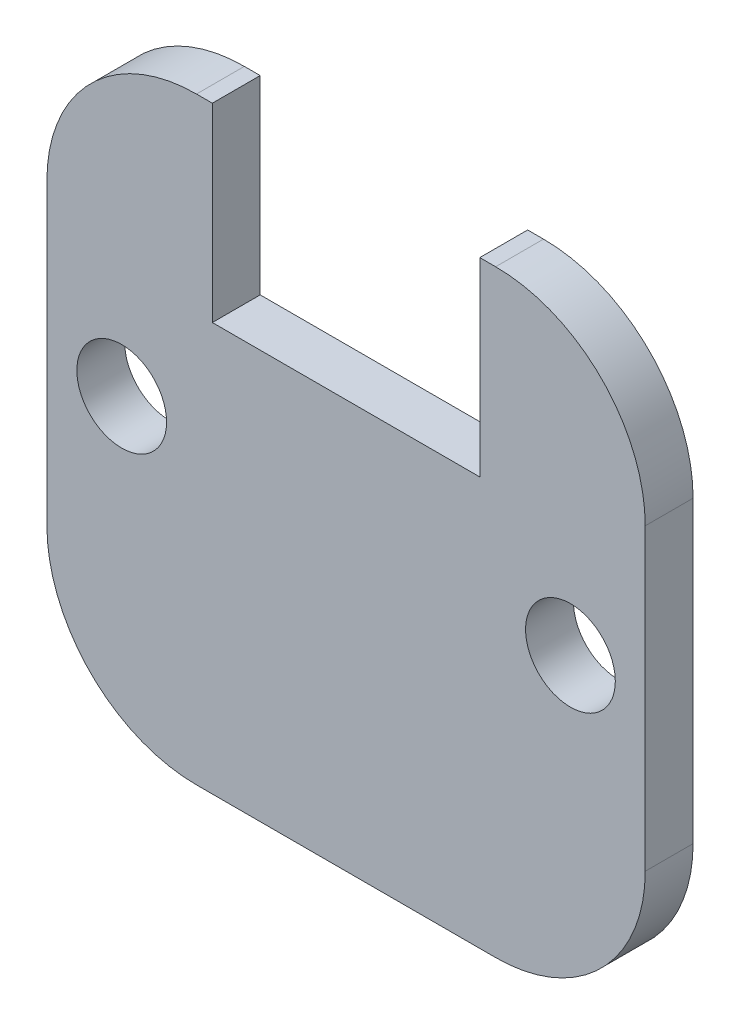
ISO-10303-21;
HEADER;
FILE_DESCRIPTION(('STEP AP214'),'2;1');
FILE_NAME('part.step','',(''),(''),'','','');
FILE_SCHEMA(('AUTOMOTIVE_DESIGN { 1 0 10303 214 1 1 1 1 }'));
ENDSEC;
DATA;
#1=APPLICATION_CONTEXT('core data for automotive mechanical design processes');
#2=APPLICATION_PROTOCOL_DEFINITION('international standard','automotive_design',2000,#1);
#3=PRODUCT_CONTEXT('',#1,'mechanical');
#4=PRODUCT('Part','Part','',(#3));
#5=PRODUCT_RELATED_PRODUCT_CATEGORY('part','',(#4));
#6=PRODUCT_DEFINITION_FORMATION('','',#4);
#7=PRODUCT_DEFINITION_CONTEXT('part definition',#1,'design');
#8=PRODUCT_DEFINITION('design','',#6,#7);
#9=PRODUCT_DEFINITION_SHAPE('','',#8);
#10=(LENGTH_UNIT() NAMED_UNIT(*) SI_UNIT(.MILLI.,.METRE.));
#11=(NAMED_UNIT(*) PLANE_ANGLE_UNIT() SI_UNIT($,.RADIAN.));
#12=(NAMED_UNIT(*) SI_UNIT($,.STERADIAN.) SOLID_ANGLE_UNIT());
#13=UNCERTAINTY_MEASURE_WITH_UNIT(LENGTH_MEASURE(1.E-05),#10,'distance_accuracy_value','');
#14=(GEOMETRIC_REPRESENTATION_CONTEXT(3) GLOBAL_UNCERTAINTY_ASSIGNED_CONTEXT((#13)) GLOBAL_UNIT_ASSIGNED_CONTEXT((#10,
#11,#12)) REPRESENTATION_CONTEXT('',''));
#15=CARTESIAN_POINT('',(0.,0.,0.));
#16=DIRECTION('',(0.,0.,1.));
#17=DIRECTION('',(1.,0.,0.));
#18=AXIS2_PLACEMENT_3D('',#15,#16,#17);
#19=CARTESIAN_POINT('',(115.985407190051,0.,1.6));
#20=DIRECTION('',(1.,0.,0.));
#21=DIRECTION('',(0.,0.,-1.));
#22=AXIS2_PLACEMENT_3D('',#19,#20,#21);
#23=PLANE('',#22);
#24=DIRECTION('',(0.,-1.,0.));
#25=VECTOR('',#24,1.);
#26=CARTESIAN_POINT('',(115.985407190051,0.,0.));
#27=LINE('',#26,#25);
#28=CARTESIAN_POINT('',(115.985407190051,133.738694525702,0.));
#29=VERTEX_POINT('',#28);
#30=CARTESIAN_POINT('',(115.985407190051,127.388694525702,0.));
#31=VERTEX_POINT('',#30);
#32=EDGE_CURVE('E234',#29,#31,#27,.T.);
#33=ORIENTED_EDGE('',*,*,#32,.F.);
#34=DIRECTION('',(0.,0.,-1.));
#35=VECTOR('',#34,1.);
#36=CARTESIAN_POINT('',(115.985407190051,133.738694525702,1.6));
#37=LINE('',#36,#35);
#38=CARTESIAN_POINT('',(115.985407190051,133.738694525702,1.6));
#39=VERTEX_POINT('',#38);
#40=EDGE_CURVE('E11',#39,#29,#37,.T.);
#41=ORIENTED_EDGE('',*,*,#40,.F.);
#42=DIRECTION('',(0.,-1.,0.));
#43=VECTOR('',#42,1.);
#44=CARTESIAN_POINT('',(115.985407190051,0.,1.6));
#45=LINE('',#44,#43);
#46=CARTESIAN_POINT('',(115.985407190051,127.388694525702,1.6));
#47=VERTEX_POINT('',#46);
#48=EDGE_CURVE('E167',#39,#47,#45,.T.);
#49=ORIENTED_EDGE('',*,*,#48,.T.);
#50=DIRECTION('',(0.,0.,-1.));
#51=VECTOR('',#50,1.);
#52=CARTESIAN_POINT('',(115.985407190051,127.388694525702,1.6));
#53=LINE('',#52,#51);
#54=EDGE_CURVE('E56',#47,#31,#53,.T.);
#55=ORIENTED_EDGE('',*,*,#54,.T.);
#56=EDGE_LOOP('',(#33,#41,#49,#55));
#57=FACE_BOUND('',#56,.T.);
#58=ADVANCED_FACE('F39',(#57),#23,.T.);
#59=CARTESIAN_POINT('',(0.,133.738694525702,1.6));
#60=DIRECTION('',(0.,1.,0.));
#61=DIRECTION('',(0.,0.,1.));
#62=AXIS2_PLACEMENT_3D('',#59,#60,#61);
#63=PLANE('',#62);
#64=DIRECTION('',(1.,0.,0.));
#65=VECTOR('',#64,1.);
#66=CARTESIAN_POINT('',(0.,133.738694525702,0.));
#67=LINE('',#66,#65);
#68=CARTESIAN_POINT('',(115.455407190051,133.738694525702,0.));
#69=VERTEX_POINT('',#68);
#70=EDGE_CURVE('E227',#69,#29,#67,.T.);
#71=ORIENTED_EDGE('',*,*,#70,.F.);
#72=DIRECTION('',(0.,0.,-1.));
#73=VECTOR('',#72,1.);
#74=CARTESIAN_POINT('',(115.455407190051,133.738694525702,1.6));
#75=LINE('',#74,#73);
#76=CARTESIAN_POINT('',(115.455407190051,133.738694525702,1.6));
#77=VERTEX_POINT('',#76);
#78=EDGE_CURVE('E48',#77,#69,#75,.T.);
#79=ORIENTED_EDGE('',*,*,#78,.F.);
#80=DIRECTION('',(1.,0.,0.));
#81=VECTOR('',#80,1.);
#82=CARTESIAN_POINT('',(0.,133.738694525702,1.6));
#83=LINE('',#82,#81);
#84=EDGE_CURVE('E158',#77,#39,#83,.T.);
#85=ORIENTED_EDGE('',*,*,#84,.T.);
#86=ORIENTED_EDGE('',*,*,#40,.T.);
#87=EDGE_LOOP('',(#71,#79,#85,#86));
#88=FACE_BOUND('',#87,.T.);
#89=ADVANCED_FACE('F232',(#88),#63,.T.);
#90=CARTESIAN_POINT('',(115.455407190051,128.738694525702,1.6));
#91=DIRECTION('',(0.,0.,-1.));
#92=DIRECTION('',(-1.,0.,0.));
#93=AXIS2_PLACEMENT_3D('',#90,#91,#92);
#94=CYLINDRICAL_SURFACE('',#93,4.99999999999999);
#95=CARTESIAN_POINT('',(115.455407190051,128.738694525702,0.));
#96=DIRECTION('',(0.,0.,1.));
#97=DIRECTION('',(1.,0.,0.));
#98=AXIS2_PLACEMENT_3D('',#95,#96,#97);
#99=CIRCLE('',#98,4.99999999999999);
#100=CARTESIAN_POINT('',(110.455407190051,128.738694525702,0.));
#101=VERTEX_POINT('',#100);
#102=EDGE_CURVE('E220',#69,#101,#99,.T.);
#103=ORIENTED_EDGE('',*,*,#102,.T.);
#104=DIRECTION('',(0.,0.,-1.));
#105=VECTOR('',#104,1.);
#106=CARTESIAN_POINT('',(110.455407190051,128.738694525702,1.6));
#107=LINE('',#106,#105);
#108=CARTESIAN_POINT('',(110.455407190051,128.738694525702,1.6));
#109=VERTEX_POINT('',#108);
#110=EDGE_CURVE('E211',#109,#101,#107,.T.);
#111=ORIENTED_EDGE('',*,*,#110,.F.);
#112=CARTESIAN_POINT('',(115.455407190051,128.738694525702,1.6));
#113=DIRECTION('',(0.,0.,1.));
#114=DIRECTION('',(1.,0.,0.));
#115=AXIS2_PLACEMENT_3D('',#112,#113,#114);
#116=CIRCLE('',#115,4.99999999999999);
#117=EDGE_CURVE('E166',#77,#109,#116,.T.);
#118=ORIENTED_EDGE('',*,*,#117,.F.);
#119=ORIENTED_EDGE('',*,*,#78,.T.);
#120=EDGE_LOOP('',(#103,#111,#118,#119));
#121=FACE_BOUND('',#120,.T.);
#122=ADVANCED_FACE('F218',(#121),#94,.T.);
#123=CARTESIAN_POINT('',(110.455407190051,0.,1.6));
#124=DIRECTION('',(1.,0.,0.));
#125=DIRECTION('',(0.,0.,-1.));
#126=AXIS2_PLACEMENT_3D('',#123,#124,#125);
#127=PLANE('',#126);
#128=DIRECTION('',(0.,-1.,0.));
#129=VECTOR('',#128,1.);
#130=CARTESIAN_POINT('',(110.455407190051,0.,0.));
#131=LINE('',#130,#129);
#132=CARTESIAN_POINT('',(110.455407190051,118.738694525702,0.));
#133=VERTEX_POINT('',#132);
#134=EDGE_CURVE('E229',#101,#133,#131,.T.);
#135=ORIENTED_EDGE('',*,*,#134,.T.);
#136=DIRECTION('',(0.,0.,-1.));
#137=VECTOR('',#136,1.);
#138=CARTESIAN_POINT('',(110.455407190051,118.738694525702,1.6));
#139=LINE('',#138,#137);
#140=CARTESIAN_POINT('',(110.455407190051,118.738694525702,1.6));
#141=VERTEX_POINT('',#140);
#142=EDGE_CURVE('E207',#141,#133,#139,.T.);
#143=ORIENTED_EDGE('',*,*,#142,.F.);
#144=DIRECTION('',(0.,-1.,0.));
#145=VECTOR('',#144,1.);
#146=CARTESIAN_POINT('',(110.455407190051,0.,1.6));
#147=LINE('',#146,#145);
#148=EDGE_CURVE('E172',#109,#141,#147,.T.);
#149=ORIENTED_EDGE('',*,*,#148,.F.);
#150=ORIENTED_EDGE('',*,*,#110,.T.);
#151=EDGE_LOOP('',(#135,#143,#149,#150));
#152=FACE_BOUND('',#151,.T.);
#153=ADVANCED_FACE('F277',(#152),#127,.F.);
#154=CARTESIAN_POINT('',(115.455407190051,118.738694525702,1.6));
#155=DIRECTION('',(0.,0.,-1.));
#156=DIRECTION('',(-1.,0.,0.));
#157=AXIS2_PLACEMENT_3D('',#154,#155,#156);
#158=CYLINDRICAL_SURFACE('',#157,4.99999999999999);
#159=CARTESIAN_POINT('',(115.455407190051,118.738694525702,0.));
#160=DIRECTION('',(0.,0.,1.));
#161=DIRECTION('',(1.,0.,0.));
#162=AXIS2_PLACEMENT_3D('',#159,#160,#161);
#163=CIRCLE('',#162,4.99999999999999);
#164=CARTESIAN_POINT('',(115.455407190051,113.738694525702,0.));
#165=VERTEX_POINT('',#164);
#166=EDGE_CURVE('E313',#133,#165,#163,.T.);
#167=ORIENTED_EDGE('',*,*,#166,.T.);
#168=DIRECTION('',(0.,0.,-1.));
#169=VECTOR('',#168,1.);
#170=CARTESIAN_POINT('',(115.455407190051,113.738694525702,1.6));
#171=LINE('',#170,#169);
#172=CARTESIAN_POINT('',(115.455407190051,113.738694525702,1.6));
#173=VERTEX_POINT('',#172);
#174=EDGE_CURVE('E203',#173,#165,#171,.T.);
#175=ORIENTED_EDGE('',*,*,#174,.F.);
#176=CARTESIAN_POINT('',(115.455407190051,118.738694525702,1.6));
#177=DIRECTION('',(0.,0.,1.));
#178=DIRECTION('',(1.,0.,0.));
#179=AXIS2_PLACEMENT_3D('',#176,#177,#178);
#180=CIRCLE('',#179,4.99999999999999);
#181=EDGE_CURVE('E316',#141,#173,#180,.T.);
#182=ORIENTED_EDGE('',*,*,#181,.F.);
#183=ORIENTED_EDGE('',*,*,#142,.T.);
#184=EDGE_LOOP('',(#167,#175,#182,#183));
#185=FACE_BOUND('',#184,.T.);
#186=ADVANCED_FACE('F300',(#185),#158,.T.);
#187=CARTESIAN_POINT('',(0.,113.738694525702,1.6));
#188=DIRECTION('',(0.,1.,0.));
#189=DIRECTION('',(0.,0.,1.));
#190=AXIS2_PLACEMENT_3D('',#187,#188,#189);
#191=PLANE('',#190);
#192=DIRECTION('',(1.,0.,0.));
#193=VECTOR('',#192,1.);
#194=CARTESIAN_POINT('',(0.,113.738694525702,0.));
#195=LINE('',#194,#193);
#196=CARTESIAN_POINT('',(125.455407190051,113.738694525702,0.));
#197=VERTEX_POINT('',#196);
#198=EDGE_CURVE('E319',#165,#197,#195,.T.);
#199=ORIENTED_EDGE('',*,*,#198,.T.);
#200=DIRECTION('',(0.,0.,-1.));
#201=VECTOR('',#200,1.);
#202=CARTESIAN_POINT('',(125.455407190051,113.738694525702,1.6));
#203=LINE('',#202,#201);
#204=CARTESIAN_POINT('',(125.455407190051,113.738694525702,1.6));
#205=VERTEX_POINT('',#204);
#206=EDGE_CURVE('E199',#205,#197,#203,.T.);
#207=ORIENTED_EDGE('',*,*,#206,.F.);
#208=DIRECTION('',(1.,0.,0.));
#209=VECTOR('',#208,1.);
#210=CARTESIAN_POINT('',(0.,113.738694525702,1.6));
#211=LINE('',#210,#209);
#212=EDGE_CURVE('E335',#173,#205,#211,.T.);
#213=ORIENTED_EDGE('',*,*,#212,.F.);
#214=ORIENTED_EDGE('',*,*,#174,.T.);
#215=EDGE_LOOP('',(#199,#207,#213,#214));
#216=FACE_BOUND('',#215,.T.);
#217=ADVANCED_FACE('F296',(#216),#191,.F.);
#218=CARTESIAN_POINT('',(125.455407190051,118.738694525702,1.6));
#219=DIRECTION('',(0.,0.,-1.));
#220=DIRECTION('',(-1.,0.,0.));
#221=AXIS2_PLACEMENT_3D('',#218,#219,#220);
#222=CYLINDRICAL_SURFACE('',#221,4.99999999999999);
#223=CARTESIAN_POINT('',(125.455407190051,118.738694525702,0.));
#224=DIRECTION('',(0.,0.,1.));
#225=DIRECTION('',(1.,0.,0.));
#226=AXIS2_PLACEMENT_3D('',#223,#224,#225);
#227=CIRCLE('',#226,4.99999999999999);
#228=CARTESIAN_POINT('',(130.455407190051,118.738694525702,0.));
#229=VERTEX_POINT('',#228);
#230=EDGE_CURVE('E250',#197,#229,#227,.T.);
#231=ORIENTED_EDGE('',*,*,#230,.T.);
#232=DIRECTION('',(0.,0.,-1.));
#233=VECTOR('',#232,1.);
#234=CARTESIAN_POINT('',(130.455407190051,118.738694525702,1.6));
#235=LINE('',#234,#233);
#236=CARTESIAN_POINT('',(130.455407190051,118.738694525702,1.6));
#237=VERTEX_POINT('',#236);
#238=EDGE_CURVE('E196',#237,#229,#235,.T.);
#239=ORIENTED_EDGE('',*,*,#238,.F.);
#240=CARTESIAN_POINT('',(125.455407190051,118.738694525702,1.6));
#241=DIRECTION('',(0.,0.,1.));
#242=DIRECTION('',(1.,0.,0.));
#243=AXIS2_PLACEMENT_3D('',#240,#241,#242);
#244=CIRCLE('',#243,4.99999999999999);
#245=EDGE_CURVE('E332',#205,#237,#244,.T.);
#246=ORIENTED_EDGE('',*,*,#245,.F.);
#247=ORIENTED_EDGE('',*,*,#206,.T.);
#248=EDGE_LOOP('',(#231,#239,#246,#247));
#249=FACE_BOUND('',#248,.T.);
#250=ADVANCED_FACE('F290',(#249),#222,.T.);
#251=CARTESIAN_POINT('',(130.455407190051,0.,1.6));
#252=DIRECTION('',(1.,0.,0.));
#253=DIRECTION('',(0.,0.,-1.));
#254=AXIS2_PLACEMENT_3D('',#251,#252,#253);
#255=PLANE('',#254);
#256=DIRECTION('',(0.,-1.,0.));
#257=VECTOR('',#256,1.);
#258=CARTESIAN_POINT('',(130.455407190051,0.,0.));
#259=LINE('',#258,#257);
#260=CARTESIAN_POINT('',(130.455407190051,128.738694525702,0.));
#261=VERTEX_POINT('',#260);
#262=EDGE_CURVE('E245',#261,#229,#259,.T.);
#263=ORIENTED_EDGE('',*,*,#262,.F.);
#264=DIRECTION('',(0.,0.,-1.));
#265=VECTOR('',#264,1.);
#266=CARTESIAN_POINT('',(130.455407190051,128.738694525702,1.6));
#267=LINE('',#266,#265);
#268=CARTESIAN_POINT('',(130.455407190051,128.738694525702,1.6));
#269=VERTEX_POINT('',#268);
#270=EDGE_CURVE('E193',#269,#261,#267,.T.);
#271=ORIENTED_EDGE('',*,*,#270,.F.);
#272=DIRECTION('',(0.,-1.,0.));
#273=VECTOR('',#272,1.);
#274=CARTESIAN_POINT('',(130.455407190051,0.,1.6));
#275=LINE('',#274,#273);
#276=EDGE_CURVE('E160',#269,#237,#275,.T.);
#277=ORIENTED_EDGE('',*,*,#276,.T.);
#278=ORIENTED_EDGE('',*,*,#238,.T.);
#279=EDGE_LOOP('',(#263,#271,#277,#278));
#280=FACE_BOUND('',#279,.T.);
#281=ADVANCED_FACE('F285',(#280),#255,.T.);
#282=CARTESIAN_POINT('',(125.455407190051,128.738694525702,1.6));
#283=DIRECTION('',(0.,0.,-1.));
#284=DIRECTION('',(-1.,0.,0.));
#285=AXIS2_PLACEMENT_3D('',#282,#283,#284);
#286=CYLINDRICAL_SURFACE('',#285,4.99999999999999);
#287=CARTESIAN_POINT('',(125.455407190051,128.738694525702,0.));
#288=DIRECTION('',(0.,0.,1.));
#289=DIRECTION('',(1.,0.,0.));
#290=AXIS2_PLACEMENT_3D('',#287,#288,#289);
#291=CIRCLE('',#290,4.99999999999999);
#292=CARTESIAN_POINT('',(125.455407190051,133.738694525702,0.));
#293=VERTEX_POINT('',#292);
#294=EDGE_CURVE('E240',#293,#261,#291,.F.);
#295=ORIENTED_EDGE('',*,*,#294,.F.);
#296=DIRECTION('',(0.,0.,-1.));
#297=VECTOR('',#296,1.);
#298=CARTESIAN_POINT('',(125.455407190051,133.738694525702,1.6));
#299=LINE('',#298,#297);
#300=CARTESIAN_POINT('',(125.455407190051,133.738694525702,1.6));
#301=VERTEX_POINT('',#300);
#302=EDGE_CURVE('E141',#301,#293,#299,.T.);
#303=ORIENTED_EDGE('',*,*,#302,.F.);
#304=CARTESIAN_POINT('',(125.455407190051,128.738694525702,1.6));
#305=DIRECTION('',(0.,0.,1.));
#306=DIRECTION('',(1.,0.,0.));
#307=AXIS2_PLACEMENT_3D('',#304,#305,#306);
#308=CIRCLE('',#307,4.99999999999999);
#309=EDGE_CURVE('E155',#301,#269,#308,.F.);
#310=ORIENTED_EDGE('',*,*,#309,.T.);
#311=ORIENTED_EDGE('',*,*,#270,.T.);
#312=EDGE_LOOP('',(#295,#303,#310,#311));
#313=FACE_BOUND('',#312,.T.);
#314=ADVANCED_FACE('F280',(#313),#286,.T.);
#315=CARTESIAN_POINT('',(124.925407190051,133.738694525702,0.));
#316=VERTEX_POINT('',#315);
#317=EDGE_CURVE('E137',#316,#293,#67,.T.);
#318=ORIENTED_EDGE('',*,*,#317,.F.);
#319=DIRECTION('',(0.,0.,-1.));
#320=VECTOR('',#319,1.);
#321=CARTESIAN_POINT('',(124.925407190051,133.738694525702,1.6));
#322=LINE('',#321,#320);
#323=CARTESIAN_POINT('',(124.925407190051,133.738694525702,1.6));
#324=VERTEX_POINT('',#323);
#325=EDGE_CURVE('E131',#324,#316,#322,.T.);
#326=ORIENTED_EDGE('',*,*,#325,.F.);
#327=EDGE_CURVE('E135',#324,#301,#83,.T.);
#328=ORIENTED_EDGE('',*,*,#327,.T.);
#329=ORIENTED_EDGE('',*,*,#302,.T.);
#330=EDGE_LOOP('',(#318,#326,#328,#329));
#331=FACE_BOUND('',#330,.T.);
#332=ADVANCED_FACE('F133',(#331),#63,.T.);
#333=CARTESIAN_POINT('',(124.925407190051,0.,1.6));
#334=DIRECTION('',(1.,0.,0.));
#335=DIRECTION('',(0.,0.,-1.));
#336=AXIS2_PLACEMENT_3D('',#333,#334,#335);
#337=PLANE('',#336);
#338=DIRECTION('',(0.,-1.,0.));
#339=VECTOR('',#338,1.);
#340=CARTESIAN_POINT('',(124.925407190051,0.,0.));
#341=LINE('',#340,#339);
#342=CARTESIAN_POINT('',(124.925407190051,127.388694525702,0.));
#343=VERTEX_POINT('',#342);
#344=EDGE_CURVE('E239',#316,#343,#341,.T.);
#345=ORIENTED_EDGE('',*,*,#344,.T.);
#346=DIRECTION('',(0.,0.,-1.));
#347=VECTOR('',#346,1.);
#348=CARTESIAN_POINT('',(124.925407190051,127.388694525702,1.6));
#349=LINE('',#348,#347);
#350=CARTESIAN_POINT('',(124.925407190051,127.388694525702,1.6));
#351=VERTEX_POINT('',#350);
#352=EDGE_CURVE('E94',#351,#343,#349,.T.);
#353=ORIENTED_EDGE('',*,*,#352,.F.);
#354=DIRECTION('',(0.,-1.,0.));
#355=VECTOR('',#354,1.);
#356=CARTESIAN_POINT('',(124.925407190051,0.,1.6));
#357=LINE('',#356,#355);
#358=EDGE_CURVE('E143',#324,#351,#357,.T.);
#359=ORIENTED_EDGE('',*,*,#358,.F.);
#360=ORIENTED_EDGE('',*,*,#325,.T.);
#361=EDGE_LOOP('',(#345,#353,#359,#360));
#362=FACE_BOUND('',#361,.T.);
#363=ADVANCED_FACE('F144',(#362),#337,.F.);
#364=CARTESIAN_POINT('',(112.955407190051,123.738694525702,1.6));
#365=DIRECTION('',(0.,0.,-1.));
#366=DIRECTION('',(-1.,0.,0.));
#367=AXIS2_PLACEMENT_3D('',#364,#365,#366);
#368=CYLINDRICAL_SURFACE('',#367,1.5);
#369=CARTESIAN_POINT('',(112.955407190051,123.738694525702,1.6));
#370=DIRECTION('',(0.,0.,1.));
#371=DIRECTION('',(1.,0.,0.));
#372=AXIS2_PLACEMENT_3D('',#369,#370,#371);
#373=CIRCLE('',#372,1.5);
#374=CARTESIAN_POINT('',(114.455407190051,123.738694525702,1.6));
#375=VERTEX_POINT('',#374);
#376=EDGE_CURVE('E341',#375,#375,#373,.T.);
#377=ORIENTED_EDGE('',*,*,#376,.T.);
#378=EDGE_LOOP('',(#377));
#379=FACE_BOUND('',#378,.T.);
#380=CARTESIAN_POINT('',(112.955407190051,123.738694525702,0.));
#381=DIRECTION('',(0.,0.,1.));
#382=DIRECTION('',(1.,0.,0.));
#383=AXIS2_PLACEMENT_3D('',#380,#381,#382);
#384=CIRCLE('',#383,1.5);
#385=CARTESIAN_POINT('',(114.455407190051,123.738694525702,0.));
#386=VERTEX_POINT('',#385);
#387=EDGE_CURVE('E176',#386,#386,#384,.T.);
#388=ORIENTED_EDGE('',*,*,#387,.F.);
#389=EDGE_LOOP('',(#388));
#390=FACE_BOUND('',#389,.T.);
#391=ADVANCED_FACE('F258',(#379,#390),#368,.F.);
#392=CARTESIAN_POINT('',(-3.95497376228677E-13,127.388694525702,1.6));
#393=DIRECTION('',(0.,1.,0.));
#394=DIRECTION('',(-1.,0.,0.));
#395=AXIS2_PLACEMENT_3D('',#392,#393,#394);
#396=PLANE('',#395);
#397=DIRECTION('',(1.,0.,0.));
#398=VECTOR('',#397,1.);
#399=CARTESIAN_POINT('',(-3.95497376228677E-13,127.388694525702,0.));
#400=LINE('',#399,#398);
#401=EDGE_CURVE('E182',#31,#343,#400,.T.);
#402=ORIENTED_EDGE('',*,*,#401,.F.);
#403=ORIENTED_EDGE('',*,*,#54,.F.);
#404=DIRECTION('',(1.,0.,0.));
#405=VECTOR('',#404,1.);
#406=CARTESIAN_POINT('',(-3.95497376228677E-13,127.388694525702,1.6));
#407=LINE('',#406,#405);
#408=EDGE_CURVE('E148',#47,#351,#407,.T.);
#409=ORIENTED_EDGE('',*,*,#408,.T.);
#410=ORIENTED_EDGE('',*,*,#352,.T.);
#411=EDGE_LOOP('',(#402,#403,#409,#410));
#412=FACE_BOUND('',#411,.T.);
#413=ADVANCED_FACE('F255',(#412),#396,.T.);
#414=CARTESIAN_POINT('',(127.955407190051,123.738694525702,1.6));
#415=DIRECTION('',(0.,0.,-1.));
#416=DIRECTION('',(-1.,0.,0.));
#417=AXIS2_PLACEMENT_3D('',#414,#415,#416);
#418=CYLINDRICAL_SURFACE('',#417,1.5);
#419=CARTESIAN_POINT('',(127.955407190051,123.738694525702,1.6));
#420=DIRECTION('',(0.,0.,1.));
#421=DIRECTION('',(1.,0.,0.));
#422=AXIS2_PLACEMENT_3D('',#419,#420,#421);
#423=CIRCLE('',#422,1.5);
#424=CARTESIAN_POINT('',(129.455407190051,123.738694525702,1.6));
#425=VERTEX_POINT('',#424);
#426=EDGE_CURVE('E188',#425,#425,#423,.T.);
#427=ORIENTED_EDGE('',*,*,#426,.T.);
#428=EDGE_LOOP('',(#427));
#429=FACE_BOUND('',#428,.T.);
#430=CARTESIAN_POINT('',(127.955407190051,123.738694525702,0.));
#431=DIRECTION('',(0.,0.,1.));
#432=DIRECTION('',(1.,0.,0.));
#433=AXIS2_PLACEMENT_3D('',#430,#431,#432);
#434=CIRCLE('',#433,1.5);
#435=CARTESIAN_POINT('',(129.455407190051,123.738694525702,0.));
#436=VERTEX_POINT('',#435);
#437=EDGE_CURVE('E173',#436,#436,#434,.T.);
#438=ORIENTED_EDGE('',*,*,#437,.F.);
#439=EDGE_LOOP('',(#438));
#440=FACE_BOUND('',#439,.T.);
#441=ADVANCED_FACE('F257',(#429,#440),#418,.F.);
#442=CARTESIAN_POINT('',(0.,0.,1.6));
#443=DIRECTION('',(0.,0.,1.));
#444=DIRECTION('',(1.,0.,0.));
#445=AXIS2_PLACEMENT_3D('',#442,#443,#444);
#446=PLANE('',#445);
#447=ORIENTED_EDGE('',*,*,#48,.F.);
#448=ORIENTED_EDGE('',*,*,#84,.F.);
#449=ORIENTED_EDGE('',*,*,#117,.T.);
#450=ORIENTED_EDGE('',*,*,#148,.T.);
#451=ORIENTED_EDGE('',*,*,#181,.T.);
#452=ORIENTED_EDGE('',*,*,#212,.T.);
#453=ORIENTED_EDGE('',*,*,#245,.T.);
#454=ORIENTED_EDGE('',*,*,#276,.F.);
#455=ORIENTED_EDGE('',*,*,#309,.F.);
#456=ORIENTED_EDGE('',*,*,#327,.F.);
#457=ORIENTED_EDGE('',*,*,#358,.T.);
#458=ORIENTED_EDGE('',*,*,#408,.F.);
#459=EDGE_LOOP('',(#447,#448,#449,#450,#451,#452,#453,#454,#455,#456,#457,#458));
#460=FACE_BOUND('',#459,.T.);
#461=ORIENTED_EDGE('',*,*,#376,.F.);
#462=EDGE_LOOP('',(#461));
#463=FACE_BOUND('',#462,.T.);
#464=ORIENTED_EDGE('',*,*,#426,.F.);
#465=EDGE_LOOP('',(#464));
#466=FACE_BOUND('',#465,.T.);
#467=ADVANCED_FACE('F151',(#460,#463,#466),#446,.T.);
#468=CARTESIAN_POINT('',(0.,0.,0.));
#469=DIRECTION('',(0.,0.,1.));
#470=DIRECTION('',(1.,0.,0.));
#471=AXIS2_PLACEMENT_3D('',#468,#469,#470);
#472=PLANE('',#471);
#473=ORIENTED_EDGE('',*,*,#32,.T.);
#474=ORIENTED_EDGE('',*,*,#401,.T.);
#475=ORIENTED_EDGE('',*,*,#344,.F.);
#476=ORIENTED_EDGE('',*,*,#317,.T.);
#477=ORIENTED_EDGE('',*,*,#294,.T.);
#478=ORIENTED_EDGE('',*,*,#262,.T.);
#479=ORIENTED_EDGE('',*,*,#230,.F.);
#480=ORIENTED_EDGE('',*,*,#198,.F.);
#481=ORIENTED_EDGE('',*,*,#166,.F.);
#482=ORIENTED_EDGE('',*,*,#134,.F.);
#483=ORIENTED_EDGE('',*,*,#102,.F.);
#484=ORIENTED_EDGE('',*,*,#70,.T.);
#485=EDGE_LOOP('',(#473,#474,#475,#476,#477,#478,#479,#480,#481,#482,#483,#484));
#486=FACE_BOUND('',#485,.T.);
#487=ORIENTED_EDGE('',*,*,#387,.T.);
#488=EDGE_LOOP('',(#487));
#489=FACE_BOUND('',#488,.T.);
#490=ORIENTED_EDGE('',*,*,#437,.T.);
#491=EDGE_LOOP('',(#490));
#492=FACE_BOUND('',#491,.T.);
#493=ADVANCED_FACE('F225',(#486,#489,#492),#472,.F.);
#494=CLOSED_SHELL('',(#58,#89,#122,#153,#186,#217,#250,#281,#314,#332,#363,#391,#413,#441,#467,#493));
#495=MANIFOLD_SOLID_BREP('B2',#494);
#496=ADVANCED_BREP_SHAPE_REPRESENTATION('',(#18,#495),#14);
#497=SHAPE_DEFINITION_REPRESENTATION(#9,#496);
ENDSEC;
END-ISO-10303-21;
